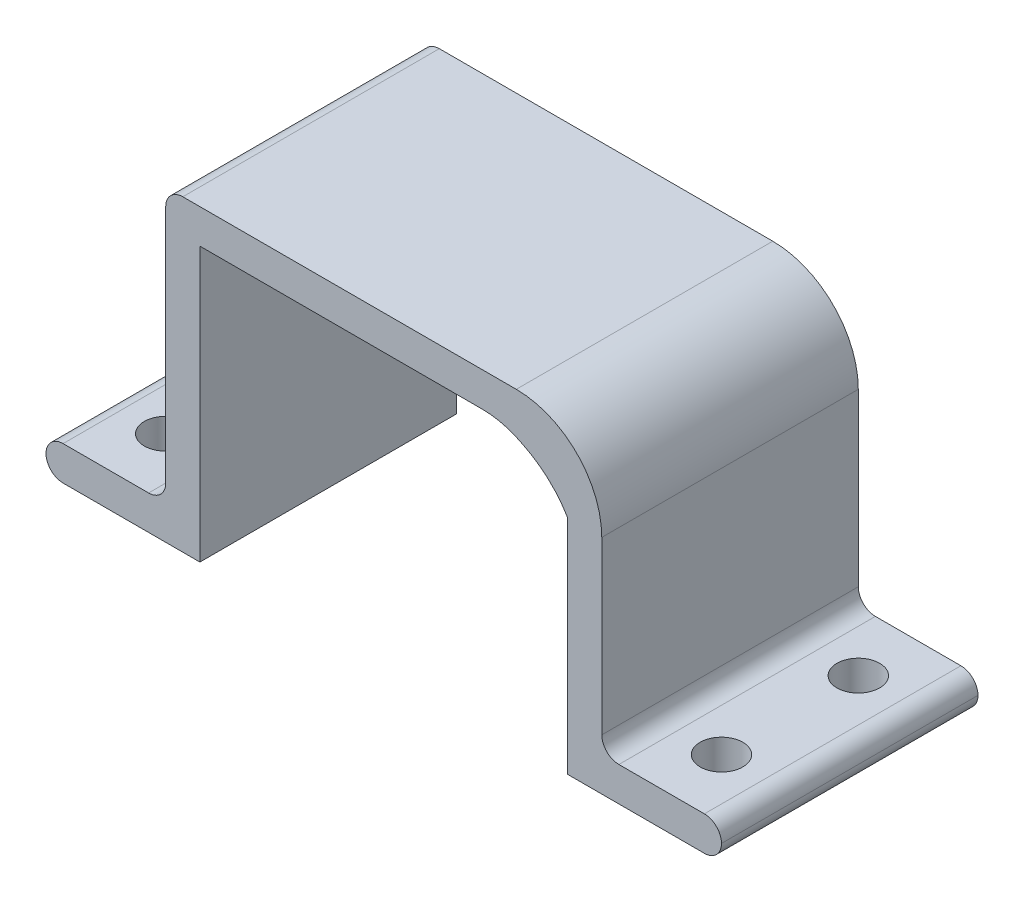
ISO-10303-21;
HEADER;
FILE_DESCRIPTION(('STEP AP214'),'2;1');
FILE_NAME('part.step','',(''),(''),'','','');
FILE_SCHEMA(('AUTOMOTIVE_DESIGN { 1 0 10303 214 1 1 1 1 }'));
ENDSEC;
DATA;
#1=APPLICATION_CONTEXT('core data for automotive mechanical design processes');
#2=APPLICATION_PROTOCOL_DEFINITION('international standard','automotive_design',2000,#1);
#3=PRODUCT_CONTEXT('',#1,'mechanical');
#4=PRODUCT('Part','Part','',(#3));
#5=PRODUCT_RELATED_PRODUCT_CATEGORY('part','',(#4));
#6=PRODUCT_DEFINITION_FORMATION('','',#4);
#7=PRODUCT_DEFINITION_CONTEXT('part definition',#1,'design');
#8=PRODUCT_DEFINITION('design','',#6,#7);
#9=PRODUCT_DEFINITION_SHAPE('','',#8);
#10=(LENGTH_UNIT() NAMED_UNIT(*) SI_UNIT(.MILLI.,.METRE.));
#11=(NAMED_UNIT(*) PLANE_ANGLE_UNIT() SI_UNIT($,.RADIAN.));
#12=(NAMED_UNIT(*) SI_UNIT($,.STERADIAN.) SOLID_ANGLE_UNIT());
#13=UNCERTAINTY_MEASURE_WITH_UNIT(LENGTH_MEASURE(1.E-05),#10,'distance_accuracy_value','');
#14=(GEOMETRIC_REPRESENTATION_CONTEXT(3) GLOBAL_UNCERTAINTY_ASSIGNED_CONTEXT((#13)) GLOBAL_UNIT_ASSIGNED_CONTEXT((#10,
#11,#12)) REPRESENTATION_CONTEXT('',''));
#15=CARTESIAN_POINT('',(0.,0.,0.));
#16=DIRECTION('',(0.,0.,1.));
#17=DIRECTION('',(1.,0.,0.));
#18=AXIS2_PLACEMENT_3D('',#15,#16,#17);
#19=CARTESIAN_POINT('',(0.,0.,30.));
#20=DIRECTION('',(0.,1.,0.));
#21=DIRECTION('',(0.,0.,1.));
#22=AXIS2_PLACEMENT_3D('',#19,#20,#21);
#23=PLANE('',#22);
#24=CARTESIAN_POINT('',(7.,0.,23.));
#25=DIRECTION('',(0.,1.,0.));
#26=DIRECTION('',(0.,0.,1.));
#27=AXIS2_PLACEMENT_3D('',#24,#25,#26);
#28=CIRCLE('',#27,2.5);
#29=CARTESIAN_POINT('',(7.,0.,25.5));
#30=VERTEX_POINT('',#29);
#31=EDGE_CURVE('E208',#30,#30,#28,.T.);
#32=ORIENTED_EDGE('',*,*,#31,.T.);
#33=EDGE_LOOP('',(#32));
#34=FACE_BOUND('',#33,.T.);
#35=CARTESIAN_POINT('',(7.,0.,7.));
#36=DIRECTION('',(0.,1.,0.));
#37=DIRECTION('',(0.,0.,1.));
#38=AXIS2_PLACEMENT_3D('',#35,#36,#37);
#39=CIRCLE('',#38,2.5);
#40=CARTESIAN_POINT('',(7.,0.,9.5));
#41=VERTEX_POINT('',#40);
#42=EDGE_CURVE('E220',#41,#41,#39,.T.);
#43=ORIENTED_EDGE('',*,*,#42,.T.);
#44=EDGE_LOOP('',(#43));
#45=FACE_BOUND('',#44,.T.);
#46=DIRECTION('',(1.,0.,0.));
#47=VECTOR('',#46,1.);
#48=CARTESIAN_POINT('',(0.,0.,30.));
#49=LINE('',#48,#47);
#50=CARTESIAN_POINT('',(2.,0.,30.));
#51=VERTEX_POINT('',#50);
#52=CARTESIAN_POINT('',(18.,0.,30.));
#53=VERTEX_POINT('',#52);
#54=EDGE_CURVE('E226',#51,#53,#49,.T.);
#55=ORIENTED_EDGE('',*,*,#54,.F.);
#56=DIRECTION('',(0.,0.,-1.));
#57=VECTOR('',#56,1.);
#58=CARTESIAN_POINT('',(2.,0.,30.));
#59=LINE('',#58,#57);
#60=CARTESIAN_POINT('',(2.,0.,0.));
#61=VERTEX_POINT('',#60);
#62=EDGE_CURVE('E329',#51,#61,#59,.T.);
#63=ORIENTED_EDGE('',*,*,#62,.T.);
#64=DIRECTION('',(1.,0.,0.));
#65=VECTOR('',#64,1.);
#66=CARTESIAN_POINT('',(0.,0.,0.));
#67=LINE('',#66,#65);
#68=CARTESIAN_POINT('',(18.,0.,0.));
#69=VERTEX_POINT('',#68);
#70=EDGE_CURVE('E223',#61,#69,#67,.T.);
#71=ORIENTED_EDGE('',*,*,#70,.T.);
#72=DIRECTION('',(0.,0.,-1.));
#73=VECTOR('',#72,1.);
#74=CARTESIAN_POINT('',(18.,0.,30.));
#75=LINE('',#74,#73);
#76=EDGE_CURVE('E291',#53,#69,#75,.T.);
#77=ORIENTED_EDGE('',*,*,#76,.F.);
#78=EDGE_LOOP('',(#55,#63,#71,#77));
#79=FACE_BOUND('',#78,.T.);
#80=ADVANCED_FACE('F33',(#34,#45,#79),#23,.F.);
#81=CARTESIAN_POINT('',(18.,0.,30.));
#82=DIRECTION('',(-1.,0.,0.));
#83=DIRECTION('',(0.,0.,1.));
#84=AXIS2_PLACEMENT_3D('',#81,#82,#83);
#85=PLANE('',#84);
#86=DIRECTION('',(0.,1.,0.));
#87=VECTOR('',#86,1.);
#88=CARTESIAN_POINT('',(18.,0.,0.));
#89=LINE('',#88,#87);
#90=CARTESIAN_POINT('',(18.,32.,0.));
#91=VERTEX_POINT('',#90);
#92=EDGE_CURVE('E257',#69,#91,#89,.T.);
#93=ORIENTED_EDGE('',*,*,#92,.T.);
#94=DIRECTION('',(0.,0.,-1.));
#95=VECTOR('',#94,1.);
#96=CARTESIAN_POINT('',(18.,32.,30.));
#97=LINE('',#96,#95);
#98=CARTESIAN_POINT('',(18.,32.,30.));
#99=VERTEX_POINT('',#98);
#100=EDGE_CURVE('E288',#99,#91,#97,.T.);
#101=ORIENTED_EDGE('',*,*,#100,.F.);
#102=DIRECTION('',(0.,1.,0.));
#103=VECTOR('',#102,1.);
#104=CARTESIAN_POINT('',(18.,0.,30.));
#105=LINE('',#104,#103);
#106=EDGE_CURVE('E228',#53,#99,#105,.T.);
#107=ORIENTED_EDGE('',*,*,#106,.F.);
#108=ORIENTED_EDGE('',*,*,#76,.T.);
#109=EDGE_LOOP('',(#93,#101,#107,#108));
#110=FACE_BOUND('',#109,.T.);
#111=ADVANCED_FACE('F415',(#110),#85,.F.);
#112=CARTESIAN_POINT('',(18.,32.,30.));
#113=DIRECTION('',(0.,1.,0.));
#114=DIRECTION('',(0.,0.,1.));
#115=AXIS2_PLACEMENT_3D('',#112,#113,#114);
#116=PLANE('',#115);
#117=DIRECTION('',(1.,0.,0.));
#118=VECTOR('',#117,1.);
#119=CARTESIAN_POINT('',(18.,32.,0.));
#120=LINE('',#119,#118);
#121=CARTESIAN_POINT('',(51.,32.,0.));
#122=VERTEX_POINT('',#121);
#123=EDGE_CURVE('E259',#91,#122,#120,.T.);
#124=ORIENTED_EDGE('',*,*,#123,.T.);
#125=DIRECTION('',(0.,0.,-1.));
#126=VECTOR('',#125,1.);
#127=CARTESIAN_POINT('',(51.,32.,30.));
#128=LINE('',#127,#126);
#129=CARTESIAN_POINT('',(51.,32.,30.));
#130=VERTEX_POINT('',#129);
#131=EDGE_CURVE('E285',#130,#122,#128,.T.);
#132=ORIENTED_EDGE('',*,*,#131,.F.);
#133=DIRECTION('',(1.,0.,0.));
#134=VECTOR('',#133,1.);
#135=CARTESIAN_POINT('',(18.,32.,30.));
#136=LINE('',#135,#134);
#137=EDGE_CURVE('E231',#99,#130,#136,.T.);
#138=ORIENTED_EDGE('',*,*,#137,.F.);
#139=ORIENTED_EDGE('',*,*,#100,.T.);
#140=EDGE_LOOP('',(#124,#132,#138,#139));
#141=FACE_BOUND('',#140,.T.);
#142=ADVANCED_FACE('F420',(#141),#116,.F.);
#143=CARTESIAN_POINT('',(51.,22.,30.));
#144=DIRECTION('',(0.,0.,-1.));
#145=DIRECTION('',(-1.,0.,0.));
#146=AXIS2_PLACEMENT_3D('',#143,#144,#145);
#147=CYLINDRICAL_SURFACE('',#146,10.);
#148=CARTESIAN_POINT('',(51.,22.,0.));
#149=DIRECTION('',(0.,0.,-1.));
#150=DIRECTION('',(-1.,0.,0.));
#151=AXIS2_PLACEMENT_3D('',#148,#149,#150);
#152=CIRCLE('',#151,10.);
#153=CARTESIAN_POINT('',(55.7684741420039,30.7898608838274,0.));
#154=VERTEX_POINT('',#153);
#155=EDGE_CURVE('E183',#122,#154,#152,.T.);
#156=ORIENTED_EDGE('',*,*,#155,.T.);
#157=DIRECTION('',(0.,0.,1.));
#158=VECTOR('',#157,1.);
#159=CARTESIAN_POINT('',(55.7684741420039,30.7898608838274,0.));
#160=LINE('',#159,#158);
#161=CARTESIAN_POINT('',(55.7684741420039,30.7898608838274,30.));
#162=VERTEX_POINT('',#161);
#163=EDGE_CURVE('E191',#154,#162,#160,.T.);
#164=ORIENTED_EDGE('',*,*,#163,.T.);
#165=CARTESIAN_POINT('',(51.,22.,30.));
#166=DIRECTION('',(0.,0.,-1.));
#167=DIRECTION('',(-1.,0.,0.));
#168=AXIS2_PLACEMENT_3D('',#165,#166,#167);
#169=CIRCLE('',#168,10.);
#170=EDGE_CURVE('E233',#130,#162,#169,.T.);
#171=ORIENTED_EDGE('',*,*,#170,.F.);
#172=ORIENTED_EDGE('',*,*,#131,.T.);
#173=EDGE_LOOP('',(#156,#164,#171,#172));
#174=FACE_BOUND('',#173,.T.);
#175=ADVANCED_FACE('F427',(#174),#147,.F.);
#176=CARTESIAN_POINT('',(61.,22.,30.));
#177=DIRECTION('',(1.,0.,0.));
#178=DIRECTION('',(0.,0.,-1.));
#179=AXIS2_PLACEMENT_3D('',#176,#177,#178);
#180=PLANE('',#179);
#181=DIRECTION('',(0.,-1.,0.));
#182=VECTOR('',#181,1.);
#183=CARTESIAN_POINT('',(61.,22.,0.));
#184=LINE('',#183,#182);
#185=CARTESIAN_POINT('',(61.,26.007623501962,0.));
#186=VERTEX_POINT('',#185);
#187=CARTESIAN_POINT('',(61.,0.,0.));
#188=VERTEX_POINT('',#187);
#189=EDGE_CURVE('E171',#186,#188,#184,.T.);
#190=ORIENTED_EDGE('',*,*,#189,.T.);
#191=DIRECTION('',(0.,0.,-1.));
#192=VECTOR('',#191,1.);
#193=CARTESIAN_POINT('',(61.,0.,30.));
#194=LINE('',#193,#192);
#195=CARTESIAN_POINT('',(61.,0.,30.));
#196=VERTEX_POINT('',#195);
#197=EDGE_CURVE('E283',#196,#188,#194,.T.);
#198=ORIENTED_EDGE('',*,*,#197,.F.);
#199=DIRECTION('',(0.,-1.,0.));
#200=VECTOR('',#199,1.);
#201=CARTESIAN_POINT('',(61.,22.,30.));
#202=LINE('',#201,#200);
#203=CARTESIAN_POINT('',(61.,26.007623501962,30.));
#204=VERTEX_POINT('',#203);
#205=EDGE_CURVE('E188',#204,#196,#202,.T.);
#206=ORIENTED_EDGE('',*,*,#205,.F.);
#207=DIRECTION('',(0.,0.,1.));
#208=VECTOR('',#207,1.);
#209=CARTESIAN_POINT('',(61.,26.007623501962,0.));
#210=LINE('',#209,#208);
#211=EDGE_CURVE('E186',#186,#204,#210,.T.);
#212=ORIENTED_EDGE('',*,*,#211,.F.);
#213=EDGE_LOOP('',(#190,#198,#206,#212));
#214=FACE_BOUND('',#213,.T.);
#215=ADVANCED_FACE('F187',(#214),#180,.F.);
#216=CARTESIAN_POINT('',(61.,0.,30.));
#217=DIRECTION('',(0.,1.,0.));
#218=DIRECTION('',(0.,0.,1.));
#219=AXIS2_PLACEMENT_3D('',#216,#217,#218);
#220=PLANE('',#219);
#221=CARTESIAN_POINT('',(72.,0.,7.));
#222=DIRECTION('',(0.,1.,0.));
#223=DIRECTION('',(0.,0.,1.));
#224=AXIS2_PLACEMENT_3D('',#221,#222,#223);
#225=CIRCLE('',#224,2.5);
#226=CARTESIAN_POINT('',(72.,0.,9.5));
#227=VERTEX_POINT('',#226);
#228=EDGE_CURVE('E215',#227,#227,#225,.T.);
#229=ORIENTED_EDGE('',*,*,#228,.T.);
#230=EDGE_LOOP('',(#229));
#231=FACE_BOUND('',#230,.T.);
#232=CARTESIAN_POINT('',(72.,0.,23.));
#233=DIRECTION('',(0.,1.,0.));
#234=DIRECTION('',(0.,0.,1.));
#235=AXIS2_PLACEMENT_3D('',#232,#233,#234);
#236=CIRCLE('',#235,2.5);
#237=CARTESIAN_POINT('',(72.,0.,25.5));
#238=VERTEX_POINT('',#237);
#239=EDGE_CURVE('E202',#238,#238,#236,.T.);
#240=ORIENTED_EDGE('',*,*,#239,.T.);
#241=EDGE_LOOP('',(#240));
#242=FACE_BOUND('',#241,.T.);
#243=DIRECTION('',(1.,0.,0.));
#244=VECTOR('',#243,1.);
#245=CARTESIAN_POINT('',(61.,0.,0.));
#246=LINE('',#245,#244);
#247=CARTESIAN_POINT('',(77.,0.,0.));
#248=VERTEX_POINT('',#247);
#249=EDGE_CURVE('E179',#188,#248,#246,.T.);
#250=ORIENTED_EDGE('',*,*,#249,.T.);
#251=DIRECTION('',(0.,0.,-1.));
#252=VECTOR('',#251,1.);
#253=CARTESIAN_POINT('',(77.,0.,30.));
#254=LINE('',#253,#252);
#255=CARTESIAN_POINT('',(77.,0.,30.));
#256=VERTEX_POINT('',#255);
#257=EDGE_CURVE('E304',#248,#256,#254,.F.);
#258=ORIENTED_EDGE('',*,*,#257,.T.);
#259=DIRECTION('',(1.,0.,0.));
#260=VECTOR('',#259,1.);
#261=CARTESIAN_POINT('',(61.,0.,30.));
#262=LINE('',#261,#260);
#263=EDGE_CURVE('E237',#196,#256,#262,.T.);
#264=ORIENTED_EDGE('',*,*,#263,.F.);
#265=ORIENTED_EDGE('',*,*,#197,.T.);
#266=EDGE_LOOP('',(#250,#258,#264,#265));
#267=FACE_BOUND('',#266,.T.);
#268=ADVANCED_FACE('F402',(#231,#242,#267),#220,.F.);
#269=CARTESIAN_POINT('',(65.,4.,30.));
#270=DIRECTION('',(0.,-1.,0.));
#271=DIRECTION('',(0.,0.,-1.));
#272=AXIS2_PLACEMENT_3D('',#269,#270,#271);
#273=PLANE('',#272);
#274=CARTESIAN_POINT('',(72.,4.,7.));
#275=DIRECTION('',(0.,1.,0.));
#276=DIRECTION('',(0.,0.,1.));
#277=AXIS2_PLACEMENT_3D('',#274,#275,#276);
#278=CIRCLE('',#277,2.5);
#279=CARTESIAN_POINT('',(72.,4.,9.5));
#280=VERTEX_POINT('',#279);
#281=EDGE_CURVE('E205',#280,#280,#278,.T.);
#282=ORIENTED_EDGE('',*,*,#281,.F.);
#283=EDGE_LOOP('',(#282));
#284=FACE_BOUND('',#283,.T.);
#285=CARTESIAN_POINT('',(72.,4.,23.));
#286=DIRECTION('',(0.,1.,0.));
#287=DIRECTION('',(0.,0.,1.));
#288=AXIS2_PLACEMENT_3D('',#285,#286,#287);
#289=CIRCLE('',#288,2.5);
#290=CARTESIAN_POINT('',(72.,4.,25.5));
#291=VERTEX_POINT('',#290);
#292=EDGE_CURVE('E200',#291,#291,#289,.T.);
#293=ORIENTED_EDGE('',*,*,#292,.F.);
#294=EDGE_LOOP('',(#293));
#295=FACE_BOUND('',#294,.T.);
#296=DIRECTION('',(-1.,0.,0.));
#297=VECTOR('',#296,1.);
#298=CARTESIAN_POINT('',(65.,4.,30.));
#299=LINE('',#298,#297);
#300=CARTESIAN_POINT('',(77.,4.,30.));
#301=VERTEX_POINT('',#300);
#302=CARTESIAN_POINT('',(67.,4.,30.));
#303=VERTEX_POINT('',#302);
#304=EDGE_CURVE('E240',#301,#303,#299,.T.);
#305=ORIENTED_EDGE('',*,*,#304,.F.);
#306=DIRECTION('',(0.,0.,-1.));
#307=VECTOR('',#306,1.);
#308=CARTESIAN_POINT('',(77.,4.,30.));
#309=LINE('',#308,#307);
#310=CARTESIAN_POINT('',(77.,4.,0.));
#311=VERTEX_POINT('',#310);
#312=EDGE_CURVE('E317',#301,#311,#309,.T.);
#313=ORIENTED_EDGE('',*,*,#312,.T.);
#314=DIRECTION('',(-1.,0.,0.));
#315=VECTOR('',#314,1.);
#316=CARTESIAN_POINT('',(65.,4.,0.));
#317=LINE('',#316,#315);
#318=CARTESIAN_POINT('',(67.,4.,0.));
#319=VERTEX_POINT('',#318);
#320=EDGE_CURVE('E263',#311,#319,#317,.T.);
#321=ORIENTED_EDGE('',*,*,#320,.T.);
#322=DIRECTION('',(0.,0.,-1.));
#323=VECTOR('',#322,1.);
#324=CARTESIAN_POINT('',(67.,4.,30.));
#325=LINE('',#324,#323);
#326=EDGE_CURVE('E315',#319,#303,#325,.F.);
#327=ORIENTED_EDGE('',*,*,#326,.T.);
#328=EDGE_LOOP('',(#305,#313,#321,#327));
#329=FACE_BOUND('',#328,.T.);
#330=ADVANCED_FACE('F393',(#284,#295,#329),#273,.F.);
#331=CARTESIAN_POINT('',(65.,26.,30.));
#332=DIRECTION('',(-1.,0.,0.));
#333=DIRECTION('',(0.,0.,1.));
#334=AXIS2_PLACEMENT_3D('',#331,#332,#333);
#335=PLANE('',#334);
#336=DIRECTION('',(0.,1.,0.));
#337=VECTOR('',#336,1.);
#338=CARTESIAN_POINT('',(65.,26.,30.));
#339=LINE('',#338,#337);
#340=CARTESIAN_POINT('',(65.,6.,30.));
#341=VERTEX_POINT('',#340);
#342=CARTESIAN_POINT('',(65.,26.,30.));
#343=VERTEX_POINT('',#342);
#344=EDGE_CURVE('E243',#341,#343,#339,.T.);
#345=ORIENTED_EDGE('',*,*,#344,.F.);
#346=DIRECTION('',(0.,0.,-1.));
#347=VECTOR('',#346,1.);
#348=CARTESIAN_POINT('',(65.,6.,0.));
#349=LINE('',#348,#347);
#350=CARTESIAN_POINT('',(65.,6.,0.));
#351=VERTEX_POINT('',#350);
#352=EDGE_CURVE('E319',#341,#351,#349,.T.);
#353=ORIENTED_EDGE('',*,*,#352,.T.);
#354=DIRECTION('',(0.,1.,0.));
#355=VECTOR('',#354,1.);
#356=CARTESIAN_POINT('',(65.,26.,0.));
#357=LINE('',#356,#355);
#358=CARTESIAN_POINT('',(65.,26.,0.));
#359=VERTEX_POINT('',#358);
#360=EDGE_CURVE('E266',#351,#359,#357,.T.);
#361=ORIENTED_EDGE('',*,*,#360,.T.);
#362=DIRECTION('',(0.,0.,-1.));
#363=VECTOR('',#362,1.);
#364=CARTESIAN_POINT('',(65.,26.,30.));
#365=LINE('',#364,#363);
#366=EDGE_CURVE('E280',#343,#359,#365,.T.);
#367=ORIENTED_EDGE('',*,*,#366,.F.);
#368=EDGE_LOOP('',(#345,#353,#361,#367));
#369=FACE_BOUND('',#368,.T.);
#370=ADVANCED_FACE('F385',(#369),#335,.F.);
#371=CARTESIAN_POINT('',(55.,26.,30.));
#372=DIRECTION('',(0.,0.,-1.));
#373=DIRECTION('',(-1.,0.,0.));
#374=AXIS2_PLACEMENT_3D('',#371,#372,#373);
#375=CYLINDRICAL_SURFACE('',#374,10.);
#376=CARTESIAN_POINT('',(55.,26.,0.));
#377=DIRECTION('',(0.,0.,1.));
#378=DIRECTION('',(1.,0.,0.));
#379=AXIS2_PLACEMENT_3D('',#376,#377,#378);
#380=CIRCLE('',#379,10.);
#381=CARTESIAN_POINT('',(55.,36.,0.));
#382=VERTEX_POINT('',#381);
#383=EDGE_CURVE('E268',#359,#382,#380,.T.);
#384=ORIENTED_EDGE('',*,*,#383,.T.);
#385=DIRECTION('',(0.,0.,-1.));
#386=VECTOR('',#385,1.);
#387=CARTESIAN_POINT('',(55.,36.,30.));
#388=LINE('',#387,#386);
#389=CARTESIAN_POINT('',(55.,36.,30.));
#390=VERTEX_POINT('',#389);
#391=EDGE_CURVE('E255',#390,#382,#388,.T.);
#392=ORIENTED_EDGE('',*,*,#391,.F.);
#393=CARTESIAN_POINT('',(55.,26.,30.));
#394=DIRECTION('',(0.,0.,1.));
#395=DIRECTION('',(1.,0.,0.));
#396=AXIS2_PLACEMENT_3D('',#393,#394,#395);
#397=CIRCLE('',#396,10.);
#398=EDGE_CURVE('E245',#343,#390,#397,.T.);
#399=ORIENTED_EDGE('',*,*,#398,.F.);
#400=ORIENTED_EDGE('',*,*,#366,.T.);
#401=EDGE_LOOP('',(#384,#392,#399,#400));
#402=FACE_BOUND('',#401,.T.);
#403=ADVANCED_FACE('F379',(#402),#375,.T.);
#404=CARTESIAN_POINT('',(14.,36.,30.));
#405=DIRECTION('',(0.,-1.,0.));
#406=DIRECTION('',(0.,0.,-1.));
#407=AXIS2_PLACEMENT_3D('',#404,#405,#406);
#408=PLANE('',#407);
#409=DIRECTION('',(-1.,0.,0.));
#410=VECTOR('',#409,1.);
#411=CARTESIAN_POINT('',(14.,36.,0.));
#412=LINE('',#411,#410);
#413=CARTESIAN_POINT('',(16.,36.,0.));
#414=VERTEX_POINT('',#413);
#415=EDGE_CURVE('E270',#382,#414,#412,.T.);
#416=ORIENTED_EDGE('',*,*,#415,.T.);
#417=DIRECTION('',(0.,0.,-1.));
#418=VECTOR('',#417,1.);
#419=CARTESIAN_POINT('',(16.,36.,30.));
#420=LINE('',#419,#418);
#421=CARTESIAN_POINT('',(16.,36.,30.));
#422=VERTEX_POINT('',#421);
#423=EDGE_CURVE('E327',#414,#422,#420,.F.);
#424=ORIENTED_EDGE('',*,*,#423,.T.);
#425=DIRECTION('',(-1.,0.,0.));
#426=VECTOR('',#425,1.);
#427=CARTESIAN_POINT('',(14.,36.,30.));
#428=LINE('',#427,#426);
#429=EDGE_CURVE('E247',#390,#422,#428,.T.);
#430=ORIENTED_EDGE('',*,*,#429,.F.);
#431=ORIENTED_EDGE('',*,*,#391,.T.);
#432=EDGE_LOOP('',(#416,#424,#430,#431));
#433=FACE_BOUND('',#432,.T.);
#434=ADVANCED_FACE('F374',(#433),#408,.F.);
#435=CARTESIAN_POINT('',(14.,4.,30.));
#436=DIRECTION('',(1.,0.,0.));
#437=DIRECTION('',(0.,0.,-1.));
#438=AXIS2_PLACEMENT_3D('',#435,#436,#437);
#439=PLANE('',#438);
#440=DIRECTION('',(0.,-1.,0.));
#441=VECTOR('',#440,1.);
#442=CARTESIAN_POINT('',(14.,4.,30.));
#443=LINE('',#442,#441);
#444=CARTESIAN_POINT('',(14.,34.,30.));
#445=VERTEX_POINT('',#444);
#446=CARTESIAN_POINT('',(14.,6.,30.));
#447=VERTEX_POINT('',#446);
#448=EDGE_CURVE('E250',#445,#447,#443,.T.);
#449=ORIENTED_EDGE('',*,*,#448,.F.);
#450=DIRECTION('',(0.,0.,-1.));
#451=VECTOR('',#450,1.);
#452=CARTESIAN_POINT('',(14.,34.,30.));
#453=LINE('',#452,#451);
#454=CARTESIAN_POINT('',(14.,34.,0.));
#455=VERTEX_POINT('',#454);
#456=EDGE_CURVE('E324',#445,#455,#453,.T.);
#457=ORIENTED_EDGE('',*,*,#456,.T.);
#458=DIRECTION('',(0.,-1.,0.));
#459=VECTOR('',#458,1.);
#460=CARTESIAN_POINT('',(14.,4.,0.));
#461=LINE('',#460,#459);
#462=CARTESIAN_POINT('',(14.,6.,0.));
#463=VERTEX_POINT('',#462);
#464=EDGE_CURVE('E273',#455,#463,#461,.T.);
#465=ORIENTED_EDGE('',*,*,#464,.T.);
#466=DIRECTION('',(0.,0.,-1.));
#467=VECTOR('',#466,1.);
#468=CARTESIAN_POINT('',(14.,6.,30.));
#469=LINE('',#468,#467);
#470=EDGE_CURVE('E322',#463,#447,#469,.F.);
#471=ORIENTED_EDGE('',*,*,#470,.T.);
#472=EDGE_LOOP('',(#449,#457,#465,#471));
#473=FACE_BOUND('',#472,.T.);
#474=ADVANCED_FACE('F365',(#473),#439,.F.);
#475=CARTESIAN_POINT('',(0.,4.,30.));
#476=DIRECTION('',(0.,-1.,0.));
#477=DIRECTION('',(0.,0.,-1.));
#478=AXIS2_PLACEMENT_3D('',#475,#476,#477);
#479=PLANE('',#478);
#480=CARTESIAN_POINT('',(7.,4.,23.));
#481=DIRECTION('',(0.,1.,0.));
#482=DIRECTION('',(0.,0.,1.));
#483=AXIS2_PLACEMENT_3D('',#480,#481,#482);
#484=CIRCLE('',#483,2.5);
#485=CARTESIAN_POINT('',(7.,4.,25.5));
#486=VERTEX_POINT('',#485);
#487=EDGE_CURVE('E212',#486,#486,#484,.T.);
#488=ORIENTED_EDGE('',*,*,#487,.F.);
#489=EDGE_LOOP('',(#488));
#490=FACE_BOUND('',#489,.T.);
#491=CARTESIAN_POINT('',(7.,4.,7.));
#492=DIRECTION('',(0.,1.,0.));
#493=DIRECTION('',(0.,0.,1.));
#494=AXIS2_PLACEMENT_3D('',#491,#492,#493);
#495=CIRCLE('',#494,2.5);
#496=CARTESIAN_POINT('',(7.,4.,9.5));
#497=VERTEX_POINT('',#496);
#498=EDGE_CURVE('E211',#497,#497,#495,.T.);
#499=ORIENTED_EDGE('',*,*,#498,.F.);
#500=EDGE_LOOP('',(#499));
#501=FACE_BOUND('',#500,.T.);
#502=DIRECTION('',(-1.,0.,0.));
#503=VECTOR('',#502,1.);
#504=CARTESIAN_POINT('',(0.,4.,0.));
#505=LINE('',#504,#503);
#506=CARTESIAN_POINT('',(12.,4.,0.));
#507=VERTEX_POINT('',#506);
#508=CARTESIAN_POINT('',(2.,4.,0.));
#509=VERTEX_POINT('',#508);
#510=EDGE_CURVE('E229',#507,#509,#505,.T.);
#511=ORIENTED_EDGE('',*,*,#510,.T.);
#512=DIRECTION('',(0.,0.,-1.));
#513=VECTOR('',#512,1.);
#514=CARTESIAN_POINT('',(2.,4.,30.));
#515=LINE('',#514,#513);
#516=CARTESIAN_POINT('',(2.,4.,30.));
#517=VERTEX_POINT('',#516);
#518=EDGE_CURVE('E335',#509,#517,#515,.F.);
#519=ORIENTED_EDGE('',*,*,#518,.T.);
#520=DIRECTION('',(-1.,0.,0.));
#521=VECTOR('',#520,1.);
#522=CARTESIAN_POINT('',(0.,4.,30.));
#523=LINE('',#522,#521);
#524=CARTESIAN_POINT('',(12.,4.,30.));
#525=VERTEX_POINT('',#524);
#526=EDGE_CURVE('E253',#525,#517,#523,.T.);
#527=ORIENTED_EDGE('',*,*,#526,.F.);
#528=DIRECTION('',(0.,0.,-1.));
#529=VECTOR('',#528,1.);
#530=CARTESIAN_POINT('',(12.,4.,0.));
#531=LINE('',#530,#529);
#532=EDGE_CURVE('E332',#525,#507,#531,.T.);
#533=ORIENTED_EDGE('',*,*,#532,.T.);
#534=EDGE_LOOP('',(#511,#519,#527,#533));
#535=FACE_BOUND('',#534,.T.);
#536=ADVANCED_FACE('F356',(#490,#501,#535),#479,.F.);
#537=CARTESIAN_POINT('',(55.,26.,30.));
#538=DIRECTION('',(0.,0.,1.));
#539=DIRECTION('',(1.,0.,0.));
#540=AXIS2_PLACEMENT_3D('',#537,#538,#539);
#541=PLANE('',#540);
#542=ORIENTED_EDGE('',*,*,#263,.T.);
#543=CARTESIAN_POINT('',(77.,2.,30.));
#544=DIRECTION('',(0.,0.,1.));
#545=DIRECTION('',(1.,0.,0.));
#546=AXIS2_PLACEMENT_3D('',#543,#544,#545);
#547=CIRCLE('',#546,2.);
#548=CARTESIAN_POINT('',(79.,2.,30.));
#549=VERTEX_POINT('',#548);
#550=EDGE_CURVE('E313',#256,#549,#547,.T.);
#551=ORIENTED_EDGE('',*,*,#550,.T.);
#552=CARTESIAN_POINT('',(77.,2.,30.));
#553=DIRECTION('',(0.,0.,1.));
#554=DIRECTION('',(1.,0.,0.));
#555=AXIS2_PLACEMENT_3D('',#552,#553,#554);
#556=CIRCLE('',#555,2.);
#557=EDGE_CURVE('E311',#549,#301,#556,.T.);
#558=ORIENTED_EDGE('',*,*,#557,.T.);
#559=ORIENTED_EDGE('',*,*,#304,.T.);
#560=CARTESIAN_POINT('',(67.,6.,30.));
#561=DIRECTION('',(0.,0.,1.));
#562=DIRECTION('',(1.,0.,0.));
#563=AXIS2_PLACEMENT_3D('',#560,#561,#562);
#564=CIRCLE('',#563,2.);
#565=EDGE_CURVE('E339',#303,#341,#564,.F.);
#566=ORIENTED_EDGE('',*,*,#565,.T.);
#567=ORIENTED_EDGE('',*,*,#344,.T.);
#568=ORIENTED_EDGE('',*,*,#398,.T.);
#569=ORIENTED_EDGE('',*,*,#429,.T.);
#570=CARTESIAN_POINT('',(16.,34.,30.));
#571=DIRECTION('',(0.,0.,1.));
#572=DIRECTION('',(1.,0.,0.));
#573=AXIS2_PLACEMENT_3D('',#570,#571,#572);
#574=CIRCLE('',#573,2.);
#575=EDGE_CURVE('E309',#422,#445,#574,.T.);
#576=ORIENTED_EDGE('',*,*,#575,.T.);
#577=ORIENTED_EDGE('',*,*,#448,.T.);
#578=CARTESIAN_POINT('',(12.,6.,30.));
#579=DIRECTION('',(0.,0.,1.));
#580=DIRECTION('',(1.,0.,0.));
#581=AXIS2_PLACEMENT_3D('',#578,#579,#580);
#582=CIRCLE('',#581,2.);
#583=EDGE_CURVE('E11',#447,#525,#582,.F.);
#584=ORIENTED_EDGE('',*,*,#583,.T.);
#585=ORIENTED_EDGE('',*,*,#526,.T.);
#586=CARTESIAN_POINT('',(2.,2.,30.));
#587=DIRECTION('',(0.,0.,1.));
#588=DIRECTION('',(1.,0.,0.));
#589=AXIS2_PLACEMENT_3D('',#586,#587,#588);
#590=CIRCLE('',#589,2.);
#591=CARTESIAN_POINT('',(0.,2.,30.));
#592=VERTEX_POINT('',#591);
#593=EDGE_CURVE('E55',#517,#592,#590,.T.);
#594=ORIENTED_EDGE('',*,*,#593,.T.);
#595=CARTESIAN_POINT('',(2.,2.,30.));
#596=DIRECTION('',(0.,0.,1.));
#597=DIRECTION('',(1.,0.,0.));
#598=AXIS2_PLACEMENT_3D('',#595,#596,#597);
#599=CIRCLE('',#598,2.);
#600=EDGE_CURVE('E50',#592,#51,#599,.T.);
#601=ORIENTED_EDGE('',*,*,#600,.T.);
#602=ORIENTED_EDGE('',*,*,#54,.T.);
#603=ORIENTED_EDGE('',*,*,#106,.T.);
#604=ORIENTED_EDGE('',*,*,#137,.T.);
#605=ORIENTED_EDGE('',*,*,#170,.T.);
#606=CARTESIAN_POINT('',(50.4100655391118,19.6754017908952,30.));
#607=DIRECTION('',(0.,0.,1.));
#608=DIRECTION('',(1.,0.,0.));
#609=AXIS2_PLACEMENT_3D('',#606,#607,#608);
#610=CIRCLE('',#609,12.3387091579311);
#611=EDGE_CURVE('E195',#204,#162,#610,.T.);
#612=ORIENTED_EDGE('',*,*,#611,.F.);
#613=ORIENTED_EDGE('',*,*,#205,.T.);
#614=EDGE_LOOP('',(#542,#551,#558,#559,#566,#567,#568,#569,#576,#577,#584,#585,#594,#601,#602,
#603,#604,#605,#612,#613));
#615=FACE_BOUND('',#614,.T.);
#616=ADVANCED_FACE('F395',(#615),#541,.T.);
#617=CARTESIAN_POINT('',(55.,26.,0.));
#618=DIRECTION('',(0.,0.,1.));
#619=DIRECTION('',(1.,0.,0.));
#620=AXIS2_PLACEMENT_3D('',#617,#618,#619);
#621=PLANE('',#620);
#622=CARTESIAN_POINT('',(77.,2.,0.));
#623=DIRECTION('',(0.,0.,1.));
#624=DIRECTION('',(1.,0.,0.));
#625=AXIS2_PLACEMENT_3D('',#622,#623,#624);
#626=CIRCLE('',#625,2.);
#627=CARTESIAN_POINT('',(79.,2.,0.));
#628=VERTEX_POINT('',#627);
#629=EDGE_CURVE('E300',#311,#628,#626,.F.);
#630=ORIENTED_EDGE('',*,*,#629,.T.);
#631=CARTESIAN_POINT('',(77.,2.,0.));
#632=DIRECTION('',(0.,0.,1.));
#633=DIRECTION('',(1.,0.,0.));
#634=AXIS2_PLACEMENT_3D('',#631,#632,#633);
#635=CIRCLE('',#634,2.);
#636=EDGE_CURVE('E302',#628,#248,#635,.F.);
#637=ORIENTED_EDGE('',*,*,#636,.T.);
#638=ORIENTED_EDGE('',*,*,#249,.F.);
#639=ORIENTED_EDGE('',*,*,#189,.F.);
#640=CARTESIAN_POINT('',(50.4100655391118,19.6754017908952,0.));
#641=DIRECTION('',(0.,0.,1.));
#642=DIRECTION('',(1.,0.,0.));
#643=AXIS2_PLACEMENT_3D('',#640,#641,#642);
#644=CIRCLE('',#643,12.3387091579311);
#645=EDGE_CURVE('E176',#186,#154,#644,.T.);
#646=ORIENTED_EDGE('',*,*,#645,.T.);
#647=ORIENTED_EDGE('',*,*,#155,.F.);
#648=ORIENTED_EDGE('',*,*,#123,.F.);
#649=ORIENTED_EDGE('',*,*,#92,.F.);
#650=ORIENTED_EDGE('',*,*,#70,.F.);
#651=CARTESIAN_POINT('',(2.,2.,0.));
#652=DIRECTION('',(0.,0.,1.));
#653=DIRECTION('',(1.,0.,0.));
#654=AXIS2_PLACEMENT_3D('',#651,#652,#653);
#655=CIRCLE('',#654,2.);
#656=CARTESIAN_POINT('',(0.,2.,0.));
#657=VERTEX_POINT('',#656);
#658=EDGE_CURVE('E296',#61,#657,#655,.F.);
#659=ORIENTED_EDGE('',*,*,#658,.T.);
#660=CARTESIAN_POINT('',(2.,2.,0.));
#661=DIRECTION('',(0.,0.,1.));
#662=DIRECTION('',(1.,0.,0.));
#663=AXIS2_PLACEMENT_3D('',#660,#661,#662);
#664=CIRCLE('',#663,2.);
#665=EDGE_CURVE('E294',#657,#509,#664,.F.);
#666=ORIENTED_EDGE('',*,*,#665,.T.);
#667=ORIENTED_EDGE('',*,*,#510,.F.);
#668=CARTESIAN_POINT('',(12.,6.,0.));
#669=DIRECTION('',(0.,0.,1.));
#670=DIRECTION('',(1.,0.,0.));
#671=AXIS2_PLACEMENT_3D('',#668,#669,#670);
#672=CIRCLE('',#671,2.);
#673=EDGE_CURVE('E42',#507,#463,#672,.T.);
#674=ORIENTED_EDGE('',*,*,#673,.T.);
#675=ORIENTED_EDGE('',*,*,#464,.F.);
#676=CARTESIAN_POINT('',(16.,34.,0.));
#677=DIRECTION('',(0.,0.,1.));
#678=DIRECTION('',(1.,0.,0.));
#679=AXIS2_PLACEMENT_3D('',#676,#677,#678);
#680=CIRCLE('',#679,2.);
#681=EDGE_CURVE('E298',#455,#414,#680,.F.);
#682=ORIENTED_EDGE('',*,*,#681,.T.);
#683=ORIENTED_EDGE('',*,*,#415,.F.);
#684=ORIENTED_EDGE('',*,*,#383,.F.);
#685=ORIENTED_EDGE('',*,*,#360,.F.);
#686=CARTESIAN_POINT('',(67.,6.,0.));
#687=DIRECTION('',(0.,0.,1.));
#688=DIRECTION('',(1.,0.,0.));
#689=AXIS2_PLACEMENT_3D('',#686,#687,#688);
#690=CIRCLE('',#689,2.);
#691=EDGE_CURVE('E337',#351,#319,#690,.T.);
#692=ORIENTED_EDGE('',*,*,#691,.T.);
#693=ORIENTED_EDGE('',*,*,#320,.F.);
#694=EDGE_LOOP('',(#630,#637,#638,#639,#646,#647,#648,#649,#650,#659,#666,#667,#674,#675,#682,
#683,#684,#685,#692,#693));
#695=FACE_BOUND('',#694,.T.);
#696=ADVANCED_FACE('F173',(#695),#621,.F.);
#697=CARTESIAN_POINT('',(7.,0.,7.));
#698=DIRECTION('',(0.,1.,0.));
#699=DIRECTION('',(0.,0.,1.));
#700=AXIS2_PLACEMENT_3D('',#697,#698,#699);
#701=CYLINDRICAL_SURFACE('',#700,2.5);
#702=ORIENTED_EDGE('',*,*,#42,.F.);
#703=EDGE_LOOP('',(#702));
#704=FACE_BOUND('',#703,.T.);
#705=ORIENTED_EDGE('',*,*,#498,.T.);
#706=EDGE_LOOP('',(#705));
#707=FACE_BOUND('',#706,.T.);
#708=ADVANCED_FACE('F453',(#704,#707),#701,.F.);
#709=CARTESIAN_POINT('',(7.,0.,23.));
#710=DIRECTION('',(0.,1.,0.));
#711=DIRECTION('',(0.,0.,1.));
#712=AXIS2_PLACEMENT_3D('',#709,#710,#711);
#713=CYLINDRICAL_SURFACE('',#712,2.5);
#714=ORIENTED_EDGE('',*,*,#31,.F.);
#715=EDGE_LOOP('',(#714));
#716=FACE_BOUND('',#715,.T.);
#717=ORIENTED_EDGE('',*,*,#487,.T.);
#718=EDGE_LOOP('',(#717));
#719=FACE_BOUND('',#718,.T.);
#720=ADVANCED_FACE('F458',(#716,#719),#713,.F.);
#721=CARTESIAN_POINT('',(72.,0.,23.));
#722=DIRECTION('',(0.,1.,0.));
#723=DIRECTION('',(0.,0.,1.));
#724=AXIS2_PLACEMENT_3D('',#721,#722,#723);
#725=CYLINDRICAL_SURFACE('',#724,2.5);
#726=ORIENTED_EDGE('',*,*,#239,.F.);
#727=EDGE_LOOP('',(#726));
#728=FACE_BOUND('',#727,.T.);
#729=ORIENTED_EDGE('',*,*,#292,.T.);
#730=EDGE_LOOP('',(#729));
#731=FACE_BOUND('',#730,.T.);
#732=ADVANCED_FACE('F463',(#728,#731),#725,.F.);
#733=CARTESIAN_POINT('',(72.,0.,7.));
#734=DIRECTION('',(0.,1.,0.));
#735=DIRECTION('',(0.,0.,1.));
#736=AXIS2_PLACEMENT_3D('',#733,#734,#735);
#737=CYLINDRICAL_SURFACE('',#736,2.5);
#738=ORIENTED_EDGE('',*,*,#228,.F.);
#739=EDGE_LOOP('',(#738));
#740=FACE_BOUND('',#739,.T.);
#741=ORIENTED_EDGE('',*,*,#281,.T.);
#742=EDGE_LOOP('',(#741));
#743=FACE_BOUND('',#742,.T.);
#744=ADVANCED_FACE('F460',(#740,#743),#737,.F.);
#745=CARTESIAN_POINT('',(50.4100655391118,19.6754017908952,0.));
#746=DIRECTION('',(0.,0.,1.));
#747=DIRECTION('',(1.,0.,0.));
#748=AXIS2_PLACEMENT_3D('',#745,#746,#747);
#749=CYLINDRICAL_SURFACE('',#748,12.3387091579311);
#750=ORIENTED_EDGE('',*,*,#611,.T.);
#751=ORIENTED_EDGE('',*,*,#163,.F.);
#752=ORIENTED_EDGE('',*,*,#645,.F.);
#753=ORIENTED_EDGE('',*,*,#211,.T.);
#754=EDGE_LOOP('',(#750,#751,#752,#753));
#755=FACE_BOUND('',#754,.T.);
#756=ADVANCED_FACE('F193',(#755),#749,.F.);
#757=CARTESIAN_POINT('',(77.,2.,30.));
#758=DIRECTION('',(0.,0.,-1.));
#759=DIRECTION('',(-1.,0.,0.));
#760=AXIS2_PLACEMENT_3D('',#757,#758,#759);
#761=CYLINDRICAL_SURFACE('',#760,2.);
#762=ORIENTED_EDGE('',*,*,#312,.F.);
#763=ORIENTED_EDGE('',*,*,#557,.F.);
#764=DIRECTION('',(0.,0.,-1.));
#765=VECTOR('',#764,1.);
#766=CARTESIAN_POINT('',(79.,2.,30.));
#767=LINE('',#766,#765);
#768=EDGE_CURVE('E197',#628,#549,#767,.F.);
#769=ORIENTED_EDGE('',*,*,#768,.F.);
#770=ORIENTED_EDGE('',*,*,#629,.F.);
#771=EDGE_LOOP('',(#762,#763,#769,#770));
#772=FACE_BOUND('',#771,.T.);
#773=ADVANCED_FACE('F398',(#772),#761,.T.);
#774=CARTESIAN_POINT('',(77.,2.,30.));
#775=DIRECTION('',(0.,0.,-1.));
#776=DIRECTION('',(-1.,0.,0.));
#777=AXIS2_PLACEMENT_3D('',#774,#775,#776);
#778=CYLINDRICAL_SURFACE('',#777,2.);
#779=ORIENTED_EDGE('',*,*,#550,.F.);
#780=ORIENTED_EDGE('',*,*,#257,.F.);
#781=ORIENTED_EDGE('',*,*,#636,.F.);
#782=ORIENTED_EDGE('',*,*,#768,.T.);
#783=EDGE_LOOP('',(#779,#780,#781,#782));
#784=FACE_BOUND('',#783,.T.);
#785=ADVANCED_FACE('F404',(#784),#778,.T.);
#786=CARTESIAN_POINT('',(67.,6.,30.));
#787=DIRECTION('',(0.,0.,1.));
#788=DIRECTION('',(1.,0.,0.));
#789=AXIS2_PLACEMENT_3D('',#786,#787,#788);
#790=CYLINDRICAL_SURFACE('',#789,2.);
#791=ORIENTED_EDGE('',*,*,#565,.F.);
#792=ORIENTED_EDGE('',*,*,#326,.F.);
#793=ORIENTED_EDGE('',*,*,#691,.F.);
#794=ORIENTED_EDGE('',*,*,#352,.F.);
#795=EDGE_LOOP('',(#791,#792,#793,#794));
#796=FACE_BOUND('',#795,.T.);
#797=ADVANCED_FACE('F389',(#796),#790,.F.);
#798=CARTESIAN_POINT('',(16.,34.,30.));
#799=DIRECTION('',(0.,0.,-1.));
#800=DIRECTION('',(-1.,0.,0.));
#801=AXIS2_PLACEMENT_3D('',#798,#799,#800);
#802=CYLINDRICAL_SURFACE('',#801,2.);
#803=ORIENTED_EDGE('',*,*,#575,.F.);
#804=ORIENTED_EDGE('',*,*,#423,.F.);
#805=ORIENTED_EDGE('',*,*,#681,.F.);
#806=ORIENTED_EDGE('',*,*,#456,.F.);
#807=EDGE_LOOP('',(#803,#804,#805,#806));
#808=FACE_BOUND('',#807,.T.);
#809=ADVANCED_FACE('F369',(#808),#802,.T.);
#810=CARTESIAN_POINT('',(2.,2.,30.));
#811=DIRECTION('',(0.,0.,-1.));
#812=DIRECTION('',(-1.,0.,0.));
#813=AXIS2_PLACEMENT_3D('',#810,#811,#812);
#814=CYLINDRICAL_SURFACE('',#813,2.);
#815=DIRECTION('',(0.,0.,-1.));
#816=VECTOR('',#815,1.);
#817=CARTESIAN_POINT('',(0.,2.,30.));
#818=LINE('',#817,#816);
#819=EDGE_CURVE('E37',#592,#657,#818,.T.);
#820=ORIENTED_EDGE('',*,*,#819,.F.);
#821=ORIENTED_EDGE('',*,*,#593,.F.);
#822=ORIENTED_EDGE('',*,*,#518,.F.);
#823=ORIENTED_EDGE('',*,*,#665,.F.);
#824=EDGE_LOOP('',(#820,#821,#822,#823));
#825=FACE_BOUND('',#824,.T.);
#826=ADVANCED_FACE('F351',(#825),#814,.T.);
#827=CARTESIAN_POINT('',(2.,2.,30.));
#828=DIRECTION('',(0.,0.,-1.));
#829=DIRECTION('',(-1.,0.,0.));
#830=AXIS2_PLACEMENT_3D('',#827,#828,#829);
#831=CYLINDRICAL_SURFACE('',#830,2.);
#832=ORIENTED_EDGE('',*,*,#600,.F.);
#833=ORIENTED_EDGE('',*,*,#819,.T.);
#834=ORIENTED_EDGE('',*,*,#658,.F.);
#835=ORIENTED_EDGE('',*,*,#62,.F.);
#836=EDGE_LOOP('',(#832,#833,#834,#835));
#837=FACE_BOUND('',#836,.T.);
#838=ADVANCED_FACE('F347',(#837),#831,.T.);
#839=CARTESIAN_POINT('',(12.,6.,30.));
#840=DIRECTION('',(0.,0.,1.));
#841=DIRECTION('',(1.,0.,0.));
#842=AXIS2_PLACEMENT_3D('',#839,#840,#841);
#843=CYLINDRICAL_SURFACE('',#842,2.);
#844=ORIENTED_EDGE('',*,*,#583,.F.);
#845=ORIENTED_EDGE('',*,*,#470,.F.);
#846=ORIENTED_EDGE('',*,*,#673,.F.);
#847=ORIENTED_EDGE('',*,*,#532,.F.);
#848=EDGE_LOOP('',(#844,#845,#846,#847));
#849=FACE_BOUND('',#848,.T.);
#850=ADVANCED_FACE('F35',(#849),#843,.F.);
#851=CLOSED_SHELL('',(#80,#111,#142,#175,#215,#268,#330,#370,#403,#434,#474,#536,#616,#696,#708,
#720,#732,#744,#756,#773,#785,#797,#809,#826,#838,#850));
#852=MANIFOLD_SOLID_BREP('B2',#851);
#853=ADVANCED_BREP_SHAPE_REPRESENTATION('',(#18,#852),#14);
#854=SHAPE_DEFINITION_REPRESENTATION(#9,#853);
ENDSEC;
END-ISO-10303-21;
